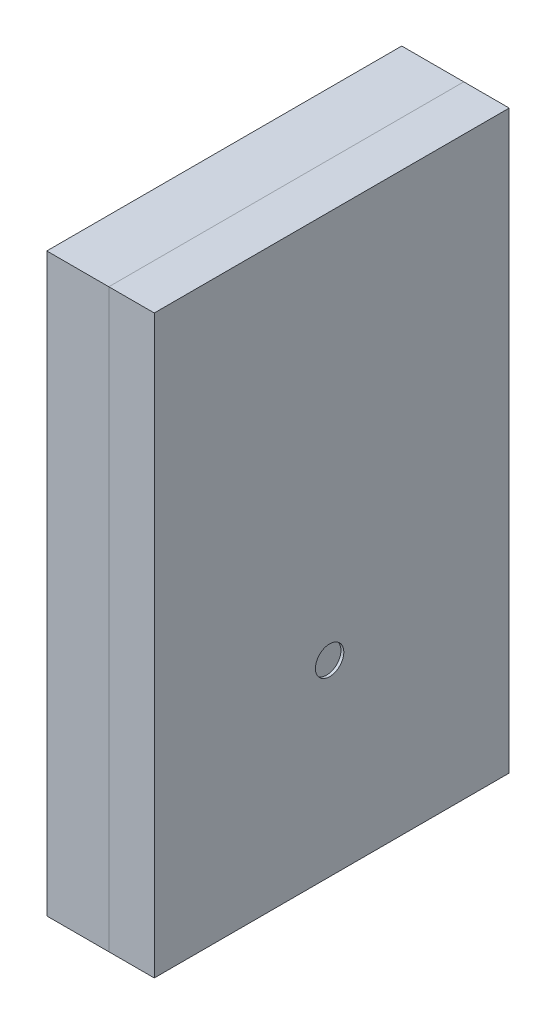
ISO-10303-21;
HEADER;
FILE_DESCRIPTION(('STEP AP214'),'2;1');
FILE_NAME('part.step','',(''),(''),'','','');
FILE_SCHEMA(('AUTOMOTIVE_DESIGN { 1 0 10303 214 1 1 1 1 }'));
ENDSEC;
DATA;
#1=APPLICATION_CONTEXT('core data for automotive mechanical design processes');
#2=APPLICATION_PROTOCOL_DEFINITION('international standard','automotive_design',2000,#1);
#3=PRODUCT_CONTEXT('',#1,'mechanical');
#4=PRODUCT('Part','Part','',(#3));
#5=PRODUCT_RELATED_PRODUCT_CATEGORY('part','',(#4));
#6=PRODUCT_DEFINITION_FORMATION('','',#4);
#7=PRODUCT_DEFINITION_CONTEXT('part definition',#1,'design');
#8=PRODUCT_DEFINITION('design','',#6,#7);
#9=PRODUCT_DEFINITION_SHAPE('','',#8);
#10=(LENGTH_UNIT() NAMED_UNIT(*) SI_UNIT(.MILLI.,.METRE.));
#11=(NAMED_UNIT(*) PLANE_ANGLE_UNIT() SI_UNIT($,.RADIAN.));
#12=(NAMED_UNIT(*) SI_UNIT($,.STERADIAN.) SOLID_ANGLE_UNIT());
#13=UNCERTAINTY_MEASURE_WITH_UNIT(LENGTH_MEASURE(1.E-05),#10,'distance_accuracy_value','');
#14=(GEOMETRIC_REPRESENTATION_CONTEXT(3) GLOBAL_UNCERTAINTY_ASSIGNED_CONTEXT((#13)) GLOBAL_UNIT_ASSIGNED_CONTEXT((#10,
#11,#12)) REPRESENTATION_CONTEXT('',''));
#15=CARTESIAN_POINT('',(0.,0.,0.));
#16=DIRECTION('',(0.,0.,1.));
#17=DIRECTION('',(1.,0.,0.));
#18=AXIS2_PLACEMENT_3D('',#15,#16,#17);
#19=CARTESIAN_POINT('',(21.1473632590377,-509.068007421901,163.632350086192));
#20=DIRECTION('',(-1.,0.,0.));
#21=DIRECTION('',(0.,0.,1.));
#22=AXIS2_PLACEMENT_3D('',#19,#20,#21);
#23=PLANE('',#22);
#24=CARTESIAN_POINT('',(21.1473632590377,-561.547783192139,163.632350086192));
#25=DIRECTION('',(-1.,0.,0.));
#26=DIRECTION('',(0.,0.,1.));
#27=AXIS2_PLACEMENT_3D('',#24,#25,#26);
#28=CIRCLE('',#27,5.);
#29=CARTESIAN_POINT('',(21.1473632590377,-561.547783192139,168.632350086192));
#30=VERTEX_POINT('',#29);
#31=EDGE_CURVE('P0_E165',#30,#30,#28,.T.);
#32=ORIENTED_EDGE('',*,*,#31,.F.);
#33=EDGE_LOOP('',(#32));
#34=FACE_BOUND('',#33,.T.);
#35=CARTESIAN_POINT('',(21.1473632590377,-536.547783192139,163.632350086192));
#36=DIRECTION('',(-1.,0.,0.));
#37=DIRECTION('',(0.,0.,1.));
#38=AXIS2_PLACEMENT_3D('',#35,#36,#37);
#39=CIRCLE('',#38,5.);
#40=CARTESIAN_POINT('',(21.1473632590377,-536.547783192139,168.632350086192));
#41=VERTEX_POINT('',#40);
#42=EDGE_CURVE('P0_E175',#41,#41,#39,.T.);
#43=ORIENTED_EDGE('',*,*,#42,.F.);
#44=EDGE_LOOP('',(#43));
#45=FACE_BOUND('',#44,.T.);
#46=DIRECTION('',(0.,0.,1.));
#47=VECTOR('',#46,1.);
#48=CARTESIAN_POINT('',(21.1473632590377,-575.097133505795,163.632350086192));
#49=LINE('',#48,#47);
#50=CARTESIAN_POINT('',(21.1473632590377,-575.097133505795,100.378378179966));
#51=VERTEX_POINT('',#50);
#52=CARTESIAN_POINT('',(21.1473632590377,-575.097133505795,225.378378179966));
#53=VERTEX_POINT('',#52);
#54=EDGE_CURVE('P0_E94',#51,#53,#49,.T.);
#55=ORIENTED_EDGE('',*,*,#54,.T.);
#56=DIRECTION('',(0.,1.,0.));
#57=VECTOR('',#56,1.);
#58=CARTESIAN_POINT('',(21.1473632590377,-581.870659021303,225.378378179966));
#59=LINE('',#58,#57);
#60=CARTESIAN_POINT('',(21.1473632590377,-372.281758853608,225.378378179966));
#61=VERTEX_POINT('',#60);
#62=EDGE_CURVE('P0_E98',#53,#61,#59,.T.);
#63=ORIENTED_EDGE('',*,*,#62,.T.);
#64=DIRECTION('',(0.,0.,1.));
#65=VECTOR('',#64,1.);
#66=CARTESIAN_POINT('',(21.1473632590377,-372.281758853608,163.632350086192));
#67=LINE('',#66,#65);
#68=CARTESIAN_POINT('',(21.1473632590377,-372.281758853608,100.378378179966));
#69=VERTEX_POINT('',#68);
#70=EDGE_CURVE('P0_E52',#69,#61,#67,.T.);
#71=ORIENTED_EDGE('',*,*,#70,.F.);
#72=DIRECTION('',(0.,1.,0.));
#73=VECTOR('',#72,1.);
#74=CARTESIAN_POINT('',(21.1473632590377,-581.870659021303,100.378378179966));
#75=LINE('',#74,#73);
#76=EDGE_CURVE('P0_E104',#51,#69,#75,.T.);
#77=ORIENTED_EDGE('',*,*,#76,.F.);
#78=EDGE_LOOP('',(#55,#63,#71,#77));
#79=FACE_BOUND('',#78,.T.);
#80=ADVANCED_FACE('P0_F17',(#34,#45,#79),#23,.T.);
#81=CARTESIAN_POINT('',(37.1473632590377,-509.068007421901,163.632350086192));
#82=DIRECTION('',(-1.,0.,0.));
#83=DIRECTION('',(0.,0.,1.));
#84=AXIS2_PLACEMENT_3D('',#81,#82,#83);
#85=CYLINDRICAL_SURFACE('',#84,5.);
#86=CARTESIAN_POINT('',(37.1473632590377,-509.068007421901,163.632350086192));
#87=DIRECTION('',(-1.,0.,0.));
#88=DIRECTION('',(0.,0.,1.));
#89=AXIS2_PLACEMENT_3D('',#86,#87,#88);
#90=CIRCLE('',#89,5.);
#91=CARTESIAN_POINT('',(37.1473632590377,-509.068007421901,168.632350086192));
#92=VERTEX_POINT('',#91);
#93=EDGE_CURVE('P0_E88',#92,#92,#90,.T.);
#94=ORIENTED_EDGE('',*,*,#93,.F.);
#95=EDGE_LOOP('',(#94));
#96=FACE_BOUND('',#95,.T.);
#97=CARTESIAN_POINT('',(36.1473632590377,-509.068007421901,163.632350086192));
#98=DIRECTION('',(-1.,0.,0.));
#99=DIRECTION('',(0.,0.,1.));
#100=AXIS2_PLACEMENT_3D('',#97,#98,#99);
#101=CIRCLE('',#100,5.);
#102=CARTESIAN_POINT('',(36.1473632590377,-509.068007421901,168.632350086192));
#103=VERTEX_POINT('',#102);
#104=EDGE_CURVE('P0_E11',#103,#103,#101,.T.);
#105=ORIENTED_EDGE('',*,*,#104,.T.);
#106=EDGE_LOOP('',(#105));
#107=FACE_BOUND('',#106,.T.);
#108=ADVANCED_FACE('P0_F121',(#96,#107),#85,.F.);
#109=CARTESIAN_POINT('',(37.1473632590377,-575.097133505795,163.632350086192));
#110=DIRECTION('',(0.,-1.,0.));
#111=DIRECTION('',(1.,0.,0.));
#112=AXIS2_PLACEMENT_3D('',#109,#110,#111);
#113=PLANE('',#112);
#114=ORIENTED_EDGE('',*,*,#54,.F.);
#115=DIRECTION('',(-1.,0.,0.));
#116=VECTOR('',#115,1.);
#117=CARTESIAN_POINT('',(37.1473632590378,-575.097133505795,100.378378179966));
#118=LINE('',#117,#116);
#119=CARTESIAN_POINT('',(37.1473632590378,-575.097133505795,100.378378179966));
#120=VERTEX_POINT('',#119);
#121=EDGE_CURVE('P0_E27',#120,#51,#118,.T.);
#122=ORIENTED_EDGE('',*,*,#121,.F.);
#123=DIRECTION('',(0.,0.,1.));
#124=VECTOR('',#123,1.);
#125=CARTESIAN_POINT('',(37.1473632590377,-575.097133505795,163.632350086192));
#126=LINE('',#125,#124);
#127=CARTESIAN_POINT('',(37.1473632590377,-575.097133505795,225.378378179966));
#128=VERTEX_POINT('',#127);
#129=EDGE_CURVE('P0_E84',#120,#128,#126,.T.);
#130=ORIENTED_EDGE('',*,*,#129,.T.);
#131=DIRECTION('',(-1.,0.,0.));
#132=VECTOR('',#131,1.);
#133=CARTESIAN_POINT('',(37.1473632590377,-575.097133505795,225.378378179966));
#134=LINE('',#133,#132);
#135=EDGE_CURVE('P0_E62',#128,#53,#134,.T.);
#136=ORIENTED_EDGE('',*,*,#135,.T.);
#137=EDGE_LOOP('',(#114,#122,#130,#136));
#138=FACE_BOUND('',#137,.T.);
#139=ADVANCED_FACE('P0_F111',(#138),#113,.T.);
#140=CARTESIAN_POINT('',(37.1473632590378,-581.870659021303,100.378378179966));
#141=DIRECTION('',(0.,0.,1.));
#142=DIRECTION('',(1.,0.,0.));
#143=AXIS2_PLACEMENT_3D('',#140,#141,#142);
#144=PLANE('',#143);
#145=ORIENTED_EDGE('',*,*,#76,.T.);
#146=DIRECTION('',(-1.,0.,0.));
#147=VECTOR('',#146,1.);
#148=CARTESIAN_POINT('',(37.1473632590378,-372.281758853608,100.378378179966));
#149=LINE('',#148,#147);
#150=CARTESIAN_POINT('',(37.1473632590378,-372.281758853608,100.378378179966));
#151=VERTEX_POINT('',#150);
#152=EDGE_CURVE('P0_E80',#151,#69,#149,.T.);
#153=ORIENTED_EDGE('',*,*,#152,.F.);
#154=DIRECTION('',(0.,1.,0.));
#155=VECTOR('',#154,1.);
#156=CARTESIAN_POINT('',(37.1473632590378,-581.870659021303,100.378378179966));
#157=LINE('',#156,#155);
#158=EDGE_CURVE('P0_E72',#120,#151,#157,.T.);
#159=ORIENTED_EDGE('',*,*,#158,.F.);
#160=ORIENTED_EDGE('',*,*,#121,.T.);
#161=EDGE_LOOP('',(#145,#153,#159,#160));
#162=FACE_BOUND('',#161,.T.);
#163=ADVANCED_FACE('P0_F112',(#162),#144,.F.);
#164=CARTESIAN_POINT('',(37.1473632590377,-372.281758853608,163.632350086192));
#165=DIRECTION('',(0.,-1.,0.));
#166=DIRECTION('',(1.,0.,0.));
#167=AXIS2_PLACEMENT_3D('',#164,#165,#166);
#168=PLANE('',#167);
#169=ORIENTED_EDGE('',*,*,#70,.T.);
#170=DIRECTION('',(-1.,0.,0.));
#171=VECTOR('',#170,1.);
#172=CARTESIAN_POINT('',(37.1473632590377,-372.281758853608,225.378378179966));
#173=LINE('',#172,#171);
#174=CARTESIAN_POINT('',(37.1473632590377,-372.281758853608,225.378378179966));
#175=VERTEX_POINT('',#174);
#176=EDGE_CURVE('P0_E77',#175,#61,#173,.T.);
#177=ORIENTED_EDGE('',*,*,#176,.F.);
#178=DIRECTION('',(0.,0.,1.));
#179=VECTOR('',#178,1.);
#180=CARTESIAN_POINT('',(37.1473632590377,-372.281758853608,163.632350086192));
#181=LINE('',#180,#179);
#182=EDGE_CURVE('P0_E67',#151,#175,#181,.T.);
#183=ORIENTED_EDGE('',*,*,#182,.F.);
#184=ORIENTED_EDGE('',*,*,#152,.T.);
#185=EDGE_LOOP('',(#169,#177,#183,#184));
#186=FACE_BOUND('',#185,.T.);
#187=ADVANCED_FACE('P0_F78',(#186),#168,.F.);
#188=CARTESIAN_POINT('',(37.1473632590377,-581.870659021303,225.378378179966));
#189=DIRECTION('',(0.,0.,1.));
#190=DIRECTION('',(1.,0.,0.));
#191=AXIS2_PLACEMENT_3D('',#188,#189,#190);
#192=PLANE('',#191);
#193=ORIENTED_EDGE('',*,*,#62,.F.);
#194=ORIENTED_EDGE('',*,*,#135,.F.);
#195=DIRECTION('',(0.,1.,0.));
#196=VECTOR('',#195,1.);
#197=CARTESIAN_POINT('',(37.1473632590377,-581.870659021303,225.378378179966));
#198=LINE('',#197,#196);
#199=EDGE_CURVE('P0_E71',#128,#175,#198,.T.);
#200=ORIENTED_EDGE('',*,*,#199,.T.);
#201=ORIENTED_EDGE('',*,*,#176,.T.);
#202=EDGE_LOOP('',(#193,#194,#200,#201));
#203=FACE_BOUND('',#202,.T.);
#204=ADVANCED_FACE('P0_F82',(#203),#192,.T.);
#205=CARTESIAN_POINT('',(37.1473632590377,-581.870659021303,163.632350086192));
#206=DIRECTION('',(-1.,0.,0.));
#207=DIRECTION('',(0.,0.,1.));
#208=AXIS2_PLACEMENT_3D('',#205,#206,#207);
#209=PLANE('',#208);
#210=ORIENTED_EDGE('',*,*,#93,.T.);
#211=EDGE_LOOP('',(#210));
#212=FACE_BOUND('',#211,.T.);
#213=ORIENTED_EDGE('',*,*,#129,.F.);
#214=ORIENTED_EDGE('',*,*,#158,.T.);
#215=ORIENTED_EDGE('',*,*,#182,.T.);
#216=ORIENTED_EDGE('',*,*,#199,.F.);
#217=EDGE_LOOP('',(#213,#214,#215,#216));
#218=FACE_BOUND('',#217,.T.);
#219=ADVANCED_FACE('P0_F70',(#212,#218),#209,.F.);
#220=CARTESIAN_POINT('',(36.1473632590377,-509.068007421901,163.632350086192));
#221=DIRECTION('',(-1.,0.,0.));
#222=DIRECTION('',(0.,0.,1.));
#223=AXIS2_PLACEMENT_3D('',#220,#221,#222);
#224=PLANE('',#223);
#225=ORIENTED_EDGE('',*,*,#104,.F.);
#226=EDGE_LOOP('',(#225));
#227=FACE_BOUND('',#226,.T.);
#228=ADVANCED_FACE('P0_F19',(#227),#224,.F.);
#229=CARTESIAN_POINT('',(26.1473632590377,-536.547783192139,163.632350086192));
#230=DIRECTION('',(-1.,0.,0.));
#231=DIRECTION('',(0.,0.,1.));
#232=AXIS2_PLACEMENT_3D('',#229,#230,#231);
#233=CYLINDRICAL_SURFACE('',#232,5.);
#234=CARTESIAN_POINT('',(26.1473632590377,-536.547783192139,163.632350086192));
#235=DIRECTION('',(-1.,0.,0.));
#236=DIRECTION('',(0.,0.,1.));
#237=AXIS2_PLACEMENT_3D('',#234,#235,#236);
#238=CIRCLE('',#237,5.);
#239=CARTESIAN_POINT('',(26.1473632590377,-536.547783192139,168.632350086192));
#240=VERTEX_POINT('',#239);
#241=EDGE_CURVE('P0_E169',#240,#240,#238,.T.);
#242=ORIENTED_EDGE('',*,*,#241,.F.);
#243=EDGE_LOOP('',(#242));
#244=FACE_BOUND('',#243,.T.);
#245=ORIENTED_EDGE('',*,*,#42,.T.);
#246=EDGE_LOOP('',(#245));
#247=FACE_BOUND('',#246,.T.);
#248=ADVANCED_FACE('P0_F142',(#244,#247),#233,.F.);
#249=CARTESIAN_POINT('',(26.1473632590377,-536.547783192139,163.632350086192));
#250=DIRECTION('',(-1.,0.,0.));
#251=DIRECTION('',(0.,0.,1.));
#252=AXIS2_PLACEMENT_3D('',#249,#250,#251);
#253=PLANE('',#252);
#254=ORIENTED_EDGE('',*,*,#241,.T.);
#255=EDGE_LOOP('',(#254));
#256=FACE_BOUND('',#255,.T.);
#257=ADVANCED_FACE('P0_F148',(#256),#253,.T.);
#258=CARTESIAN_POINT('',(26.1473632590377,-561.547783192139,163.632350086192));
#259=DIRECTION('',(-1.,0.,0.));
#260=DIRECTION('',(0.,0.,1.));
#261=AXIS2_PLACEMENT_3D('',#258,#259,#260);
#262=CYLINDRICAL_SURFACE('',#261,5.);
#263=CARTESIAN_POINT('',(26.1473632590377,-561.547783192139,163.632350086192));
#264=DIRECTION('',(-1.,0.,0.));
#265=DIRECTION('',(0.,0.,1.));
#266=AXIS2_PLACEMENT_3D('',#263,#264,#265);
#267=CIRCLE('',#266,5.);
#268=CARTESIAN_POINT('',(26.1473632590377,-561.547783192139,168.632350086192));
#269=VERTEX_POINT('',#268);
#270=EDGE_CURVE('P0_E99',#269,#269,#267,.T.);
#271=ORIENTED_EDGE('',*,*,#270,.F.);
#272=EDGE_LOOP('',(#271));
#273=FACE_BOUND('',#272,.T.);
#274=ORIENTED_EDGE('',*,*,#31,.T.);
#275=EDGE_LOOP('',(#274));
#276=FACE_BOUND('',#275,.T.);
#277=ADVANCED_FACE('P0_F152',(#273,#276),#262,.F.);
#278=CARTESIAN_POINT('',(26.1473632590377,-561.547783192139,163.632350086192));
#279=DIRECTION('',(-1.,0.,0.));
#280=DIRECTION('',(0.,0.,1.));
#281=AXIS2_PLACEMENT_3D('',#278,#279,#280);
#282=PLANE('',#281);
#283=ORIENTED_EDGE('',*,*,#270,.T.);
#284=EDGE_LOOP('',(#283));
#285=FACE_BOUND('',#284,.T.);
#286=ADVANCED_FACE('P0_F156',(#285),#282,.T.);
#287=CLOSED_SHELL('',(#80,#108,#139,#163,#187,#204,#219,#228,#248,#257,#277,#286));
#288=MANIFOLD_SOLID_BREP('P0_B1',#287);
#289=CARTESIAN_POINT('',(4.29736325903775,-575.101758853608,100.378378179966));
#290=DIRECTION('',(0.,0.,1.));
#291=DIRECTION('',(1.,0.,0.));
#292=AXIS2_PLACEMENT_3D('',#289,#290,#291);
#293=PLANE('',#292);
#294=DIRECTION('',(0.,1.,0.));
#295=VECTOR('',#294,1.);
#296=CARTESIAN_POINT('',(-0.702636740962248,-575.101758853608,100.378378179966));
#297=LINE('',#296,#295);
#298=CARTESIAN_POINT('',(-0.702636740962248,-575.101758853608,100.378378179966));
#299=VERTEX_POINT('',#298);
#300=CARTESIAN_POINT('',(-0.702636740962248,-372.281758853608,100.378378179966));
#301=VERTEX_POINT('',#300);
#302=EDGE_CURVE('P1_E136',#299,#301,#297,.T.);
#303=ORIENTED_EDGE('',*,*,#302,.T.);
#304=DIRECTION('',(-1.,0.,0.));
#305=VECTOR('',#304,1.);
#306=CARTESIAN_POINT('',(4.29736325903775,-372.281758853608,100.378378179966));
#307=LINE('',#306,#305);
#308=CARTESIAN_POINT('',(21.1473632590378,-372.281758853608,100.378378179966));
#309=VERTEX_POINT('',#308);
#310=EDGE_CURVE('P1_E11',#309,#301,#307,.T.);
#311=ORIENTED_EDGE('',*,*,#310,.F.);
#312=DIRECTION('',(0.,-1.,0.));
#313=VECTOR('',#312,1.);
#314=CARTESIAN_POINT('',(21.1473632590378,-372.281758853608,100.378378179966));
#315=LINE('',#314,#313);
#316=CARTESIAN_POINT('',(21.1473632590378,-575.101758853608,100.378378179966));
#317=VERTEX_POINT('',#316);
#318=EDGE_CURVE('P1_E114',#309,#317,#315,.T.);
#319=ORIENTED_EDGE('',*,*,#318,.T.);
#320=DIRECTION('',(-1.,0.,0.));
#321=VECTOR('',#320,1.);
#322=CARTESIAN_POINT('',(4.29736325903775,-575.101758853608,100.378378179966));
#323=LINE('',#322,#321);
#324=EDGE_CURVE('P1_E145',#317,#299,#323,.T.);
#325=ORIENTED_EDGE('',*,*,#324,.T.);
#326=EDGE_LOOP('',(#303,#311,#319,#325));
#327=FACE_BOUND('',#326,.T.);
#328=ADVANCED_FACE('P1_F17',(#327),#293,.F.);
#329=CARTESIAN_POINT('',(4.29736325903775,-372.281758853608,225.378378179966));
#330=DIRECTION('',(0.,-1.,0.));
#331=DIRECTION('',(-1.,0.,0.));
#332=AXIS2_PLACEMENT_3D('',#329,#330,#331);
#333=PLANE('',#332);
#334=DIRECTION('',(0.,0.,1.));
#335=VECTOR('',#334,1.);
#336=CARTESIAN_POINT('',(-0.702636740962251,-372.281758853608,225.378378179966));
#337=LINE('',#336,#335);
#338=CARTESIAN_POINT('',(-0.702636740962251,-372.281758853608,225.378378179966));
#339=VERTEX_POINT('',#338);
#340=EDGE_CURVE('P1_E139',#301,#339,#337,.T.);
#341=ORIENTED_EDGE('',*,*,#340,.T.);
#342=DIRECTION('',(-1.,0.,0.));
#343=VECTOR('',#342,1.);
#344=CARTESIAN_POINT('',(4.29736325903775,-372.281758853608,225.378378179966));
#345=LINE('',#344,#343);
#346=CARTESIAN_POINT('',(21.1473632590378,-372.281758853608,225.378378179966));
#347=VERTEX_POINT('',#346);
#348=EDGE_CURVE('P1_E24',#347,#339,#345,.T.);
#349=ORIENTED_EDGE('',*,*,#348,.F.);
#350=DIRECTION('',(0.,0.,-1.));
#351=VECTOR('',#350,1.);
#352=CARTESIAN_POINT('',(21.1473632590378,-372.281758853608,100.378378179966));
#353=LINE('',#352,#351);
#354=EDGE_CURVE('P1_E127',#347,#309,#353,.T.);
#355=ORIENTED_EDGE('',*,*,#354,.T.);
#356=ORIENTED_EDGE('',*,*,#310,.T.);
#357=EDGE_LOOP('',(#341,#349,#355,#356));
#358=FACE_BOUND('',#357,.T.);
#359=ADVANCED_FACE('P1_F166',(#358),#333,.F.);
#360=CARTESIAN_POINT('',(4.29736325903775,-575.101758853608,225.378378179966));
#361=DIRECTION('',(0.,0.,-1.));
#362=DIRECTION('',(-1.,0.,0.));
#363=AXIS2_PLACEMENT_3D('',#360,#361,#362);
#364=PLANE('',#363);
#365=DIRECTION('',(0.,-1.,0.));
#366=VECTOR('',#365,1.);
#367=CARTESIAN_POINT('',(-0.702636740962251,-575.101758853608,225.378378179966));
#368=LINE('',#367,#366);
#369=CARTESIAN_POINT('',(-0.702636740962251,-575.101758853608,225.378378179966));
#370=VERTEX_POINT('',#369);
#371=EDGE_CURVE('P1_E141',#339,#370,#368,.T.);
#372=ORIENTED_EDGE('',*,*,#371,.T.);
#373=DIRECTION('',(-1.,0.,0.));
#374=VECTOR('',#373,1.);
#375=CARTESIAN_POINT('',(4.29736325903775,-575.101758853608,225.378378179966));
#376=LINE('',#375,#374);
#377=CARTESIAN_POINT('',(21.1473632590378,-575.101758853608,225.378378179966));
#378=VERTEX_POINT('',#377);
#379=EDGE_CURVE('P1_E148',#378,#370,#376,.T.);
#380=ORIENTED_EDGE('',*,*,#379,.F.);
#381=DIRECTION('',(0.,1.,0.));
#382=VECTOR('',#381,1.);
#383=CARTESIAN_POINT('',(21.1473632590378,-372.281758853608,225.378378179966));
#384=LINE('',#383,#382);
#385=EDGE_CURVE('P1_E124',#378,#347,#384,.T.);
#386=ORIENTED_EDGE('',*,*,#385,.T.);
#387=ORIENTED_EDGE('',*,*,#348,.T.);
#388=EDGE_LOOP('',(#372,#380,#386,#387));
#389=FACE_BOUND('',#388,.T.);
#390=ADVANCED_FACE('P1_F153',(#389),#364,.F.);
#391=CARTESIAN_POINT('',(4.29736325903775,-575.101758853608,225.378378179966));
#392=DIRECTION('',(0.,1.,0.));
#393=DIRECTION('',(1.,0.,0.));
#394=AXIS2_PLACEMENT_3D('',#391,#392,#393);
#395=PLANE('',#394);
#396=DIRECTION('',(0.,0.,-1.));
#397=VECTOR('',#396,1.);
#398=CARTESIAN_POINT('',(-0.702636740962251,-575.101758853608,225.378378179966));
#399=LINE('',#398,#397);
#400=EDGE_CURVE('P1_E143',#370,#299,#399,.T.);
#401=ORIENTED_EDGE('',*,*,#400,.T.);
#402=ORIENTED_EDGE('',*,*,#324,.F.);
#403=DIRECTION('',(0.,0.,1.));
#404=VECTOR('',#403,1.);
#405=CARTESIAN_POINT('',(21.1473632590378,-575.101758853608,100.378378179966));
#406=LINE('',#405,#404);
#407=EDGE_CURVE('P1_E121',#317,#378,#406,.T.);
#408=ORIENTED_EDGE('',*,*,#407,.T.);
#409=ORIENTED_EDGE('',*,*,#379,.T.);
#410=EDGE_LOOP('',(#401,#402,#408,#409));
#411=FACE_BOUND('',#410,.T.);
#412=ADVANCED_FACE('P1_F162',(#411),#395,.F.);
#413=CARTESIAN_POINT('',(-0.702636740962249,-473.691758853608,162.878378179966));
#414=DIRECTION('',(-1.,0.,0.));
#415=DIRECTION('',(0.,0.,1.));
#416=AXIS2_PLACEMENT_3D('',#413,#414,#415);
#417=PLANE('',#416);
#418=CARTESIAN_POINT('',(-0.70263674096225,-455.366407842684,193.834517624346));
#419=DIRECTION('',(-1.,0.,0.));
#420=DIRECTION('',(0.,0.,1.));
#421=AXIS2_PLACEMENT_3D('',#418,#419,#420);
#422=CIRCLE('',#421,21.5);
#423=CARTESIAN_POINT('',(-0.702636740962251,-455.366407842684,215.334517624346));
#424=VERTEX_POINT('',#423);
#425=EDGE_CURVE('P1_E103',#424,#424,#422,.T.);
#426=ORIENTED_EDGE('',*,*,#425,.F.);
#427=EDGE_LOOP('',(#426));
#428=FACE_BOUND('',#427,.T.);
#429=CARTESIAN_POINT('',(-0.702636740962249,-405.426407842684,133.834517624346));
#430=DIRECTION('',(-1.,0.,0.));
#431=DIRECTION('',(0.,0.,1.));
#432=AXIS2_PLACEMENT_3D('',#429,#430,#431);
#433=CIRCLE('',#432,21.5);
#434=CARTESIAN_POINT('',(-0.702636740962249,-405.426407842684,155.334517624346));
#435=VERTEX_POINT('',#434);
#436=EDGE_CURVE('P1_E106',#435,#435,#433,.T.);
#437=ORIENTED_EDGE('',*,*,#436,.F.);
#438=EDGE_LOOP('',(#437));
#439=FACE_BOUND('',#438,.T.);
#440=CARTESIAN_POINT('',(-0.70263674096225,-405.426407842684,193.834517624346));
#441=DIRECTION('',(-1.,0.,0.));
#442=DIRECTION('',(0.,0.,1.));
#443=AXIS2_PLACEMENT_3D('',#440,#441,#442);
#444=CIRCLE('',#443,21.5);
#445=CARTESIAN_POINT('',(-0.702636740962251,-405.426407842684,215.334517624346));
#446=VERTEX_POINT('',#445);
#447=EDGE_CURVE('P1_E275',#446,#446,#444,.T.);
#448=ORIENTED_EDGE('',*,*,#447,.F.);
#449=EDGE_LOOP('',(#448));
#450=FACE_BOUND('',#449,.T.);
#451=CARTESIAN_POINT('',(-0.70263674096225,-548.986407842684,193.834517624346));
#452=DIRECTION('',(-1.,0.,0.));
#453=DIRECTION('',(0.,0.,1.));
#454=AXIS2_PLACEMENT_3D('',#451,#452,#453);
#455=CIRCLE('',#454,21.5);
#456=CARTESIAN_POINT('',(-0.702636740962251,-548.986407842684,215.334517624346));
#457=VERTEX_POINT('',#456);
#458=EDGE_CURVE('P1_E272',#457,#457,#455,.T.);
#459=ORIENTED_EDGE('',*,*,#458,.F.);
#460=EDGE_LOOP('',(#459));
#461=FACE_BOUND('',#460,.T.);
#462=CARTESIAN_POINT('',(-0.702636740962249,-502.176407842684,133.834517624346));
#463=DIRECTION('',(-1.,0.,0.));
#464=DIRECTION('',(0.,0.,1.));
#465=AXIS2_PLACEMENT_3D('',#462,#463,#464);
#466=CIRCLE('',#465,21.5);
#467=CARTESIAN_POINT('',(-0.702636740962249,-502.176407842684,155.334517624346));
#468=VERTEX_POINT('',#467);
#469=EDGE_CURVE('P1_E234',#468,#468,#466,.T.);
#470=ORIENTED_EDGE('',*,*,#469,.F.);
#471=EDGE_LOOP('',(#470));
#472=FACE_BOUND('',#471,.T.);
#473=CARTESIAN_POINT('',(-0.702636740962249,-455.366407842684,133.834517624346));
#474=DIRECTION('',(-1.,0.,0.));
#475=DIRECTION('',(0.,0.,1.));
#476=AXIS2_PLACEMENT_3D('',#473,#474,#475);
#477=CIRCLE('',#476,21.5);
#478=CARTESIAN_POINT('',(-0.702636740962249,-455.366407842684,155.334517624346));
#479=VERTEX_POINT('',#478);
#480=EDGE_CURVE('P1_E268',#479,#479,#477,.T.);
#481=ORIENTED_EDGE('',*,*,#480,.F.);
#482=EDGE_LOOP('',(#481));
#483=FACE_BOUND('',#482,.T.);
#484=CARTESIAN_POINT('',(-0.70263674096225,-502.176407842684,193.834517624346));
#485=DIRECTION('',(-1.,0.,0.));
#486=DIRECTION('',(0.,0.,1.));
#487=AXIS2_PLACEMENT_3D('',#484,#485,#486);
#488=CIRCLE('',#487,21.5);
#489=CARTESIAN_POINT('',(-0.702636740962251,-502.176407842684,215.334517624346));
#490=VERTEX_POINT('',#489);
#491=EDGE_CURVE('P1_E265',#490,#490,#488,.T.);
#492=ORIENTED_EDGE('',*,*,#491,.F.);
#493=EDGE_LOOP('',(#492));
#494=FACE_BOUND('',#493,.T.);
#495=CARTESIAN_POINT('',(-0.702636740962249,-548.986407842684,133.834517624346));
#496=DIRECTION('',(-1.,0.,0.));
#497=DIRECTION('',(0.,0.,1.));
#498=AXIS2_PLACEMENT_3D('',#495,#496,#497);
#499=CIRCLE('',#498,21.5);
#500=CARTESIAN_POINT('',(-0.702636740962249,-548.986407842684,155.334517624346));
#501=VERTEX_POINT('',#500);
#502=EDGE_CURVE('P1_E262',#501,#501,#499,.T.);
#503=ORIENTED_EDGE('',*,*,#502,.F.);
#504=EDGE_LOOP('',(#503));
#505=FACE_BOUND('',#504,.T.);
#506=ORIENTED_EDGE('',*,*,#302,.F.);
#507=ORIENTED_EDGE('',*,*,#400,.F.);
#508=ORIENTED_EDGE('',*,*,#371,.F.);
#509=ORIENTED_EDGE('',*,*,#340,.F.);
#510=EDGE_LOOP('',(#506,#507,#508,#509));
#511=FACE_BOUND('',#510,.T.);
#512=ADVANCED_FACE('P1_F160',(#428,#439,#450,#461,#472,#483,#494,#505,#511),#417,.T.);
#513=CARTESIAN_POINT('',(21.1473632590378,-571.770279423351,222.243714381443));
#514=DIRECTION('',(0.,0.,1.));
#515=DIRECTION('',(1.,0.,0.));
#516=AXIS2_PLACEMENT_3D('',#513,#514,#515);
#517=PLANE('',#516);
#518=DIRECTION('',(-1.,0.,0.));
#519=VECTOR('',#518,1.);
#520=CARTESIAN_POINT('',(21.1473632590378,-571.770279423351,222.243714381443));
#521=LINE('',#520,#519);
#522=CARTESIAN_POINT('',(21.1473632590378,-571.770279423351,222.243714381443));
#523=VERTEX_POINT('',#522);
#524=CARTESIAN_POINT('',(4.29736325903775,-571.770279423351,222.243714381443));
#525=VERTEX_POINT('',#524);
#526=EDGE_CURVE('P1_E112',#523,#525,#521,.T.);
#527=ORIENTED_EDGE('',*,*,#526,.T.);
#528=DIRECTION('',(0.,1.,0.));
#529=VECTOR('',#528,1.);
#530=CARTESIAN_POINT('',(4.29736325903775,-473.691758853608,222.243714381443));
#531=LINE('',#530,#529);
#532=CARTESIAN_POINT('',(4.29736325903775,-375.613238283866,222.243714381443));
#533=VERTEX_POINT('',#532);
#534=EDGE_CURVE('P1_E31',#525,#533,#531,.T.);
#535=ORIENTED_EDGE('',*,*,#534,.T.);
#536=DIRECTION('',(-1.,0.,0.));
#537=VECTOR('',#536,1.);
#538=CARTESIAN_POINT('',(21.1473632590378,-375.613238283866,222.243714381443));
#539=LINE('',#538,#537);
#540=CARTESIAN_POINT('',(21.1473632590378,-375.613238283866,222.243714381443));
#541=VERTEX_POINT('',#540);
#542=EDGE_CURVE('P1_E79',#541,#533,#539,.T.);
#543=ORIENTED_EDGE('',*,*,#542,.F.);
#544=DIRECTION('',(0.,1.,0.));
#545=VECTOR('',#544,1.);
#546=CARTESIAN_POINT('',(21.1473632590378,-571.770279423351,222.243714381443));
#547=LINE('',#546,#545);
#548=EDGE_CURVE('P1_E84',#523,#541,#547,.T.);
#549=ORIENTED_EDGE('',*,*,#548,.F.);
#550=EDGE_LOOP('',(#527,#535,#543,#549));
#551=FACE_BOUND('',#550,.T.);
#552=ADVANCED_FACE('P1_F82',(#551),#517,.F.);
#553=CARTESIAN_POINT('',(21.1473632590378,-571.770279423351,103.513041978488));
#554=DIRECTION('',(0.,-1.,0.));
#555=DIRECTION('',(-1.,0.,0.));
#556=AXIS2_PLACEMENT_3D('',#553,#554,#555);
#557=PLANE('',#556);
#558=DIRECTION('',(-1.,0.,0.));
#559=VECTOR('',#558,1.);
#560=CARTESIAN_POINT('',(21.1473632590378,-571.770279423351,103.513041978488));
#561=LINE('',#560,#559);
#562=CARTESIAN_POINT('',(21.1473632590378,-571.770279423351,103.513041978488));
#563=VERTEX_POINT('',#562);
#564=CARTESIAN_POINT('',(4.29736325903775,-571.770279423351,103.513041978488));
#565=VERTEX_POINT('',#564);
#566=EDGE_CURVE('P1_E115',#563,#565,#561,.T.);
#567=ORIENTED_EDGE('',*,*,#566,.T.);
#568=DIRECTION('',(0.,0.,1.));
#569=VECTOR('',#568,1.);
#570=CARTESIAN_POINT('',(4.29736325903775,-571.770279423351,162.878378179966));
#571=LINE('',#570,#569);
#572=EDGE_CURVE('P1_E35',#565,#525,#571,.T.);
#573=ORIENTED_EDGE('',*,*,#572,.T.);
#574=ORIENTED_EDGE('',*,*,#526,.F.);
#575=DIRECTION('',(0.,0.,1.));
#576=VECTOR('',#575,1.);
#577=CARTESIAN_POINT('',(21.1473632590378,-571.770279423351,103.513041978488));
#578=LINE('',#577,#576);
#579=EDGE_CURVE('P1_E89',#563,#523,#578,.T.);
#580=ORIENTED_EDGE('',*,*,#579,.F.);
#581=EDGE_LOOP('',(#567,#573,#574,#580));
#582=FACE_BOUND('',#581,.T.);
#583=ADVANCED_FACE('P1_F189',(#582),#557,.F.);
#584=CARTESIAN_POINT('',(21.1473632590378,-571.770279423351,103.513041978488));
#585=DIRECTION('',(0.,0.,-1.));
#586=DIRECTION('',(-1.,0.,0.));
#587=AXIS2_PLACEMENT_3D('',#584,#585,#586);
#588=PLANE('',#587);
#589=DIRECTION('',(-1.,0.,0.));
#590=VECTOR('',#589,1.);
#591=CARTESIAN_POINT('',(21.1473632590378,-375.613238283866,103.513041978488));
#592=LINE('',#591,#590);
#593=CARTESIAN_POINT('',(21.1473632590378,-375.613238283866,103.513041978488));
#594=VERTEX_POINT('',#593);
#595=CARTESIAN_POINT('',(4.29736325903775,-375.613238283866,103.513041978488));
#596=VERTEX_POINT('',#595);
#597=EDGE_CURVE('P1_E88',#594,#596,#592,.T.);
#598=ORIENTED_EDGE('',*,*,#597,.T.);
#599=DIRECTION('',(0.,-1.,0.));
#600=VECTOR('',#599,1.);
#601=CARTESIAN_POINT('',(4.29736325903775,-473.691758853608,103.513041978488));
#602=LINE('',#601,#600);
#603=EDGE_CURVE('P1_E132',#596,#565,#602,.T.);
#604=ORIENTED_EDGE('',*,*,#603,.T.);
#605=ORIENTED_EDGE('',*,*,#566,.F.);
#606=DIRECTION('',(0.,-1.,0.));
#607=VECTOR('',#606,1.);
#608=CARTESIAN_POINT('',(21.1473632590378,-571.770279423351,103.513041978488));
#609=LINE('',#608,#607);
#610=EDGE_CURVE('P1_E98',#594,#563,#609,.T.);
#611=ORIENTED_EDGE('',*,*,#610,.F.);
#612=EDGE_LOOP('',(#598,#604,#605,#611));
#613=FACE_BOUND('',#612,.T.);
#614=ADVANCED_FACE('P1_F192',(#613),#588,.F.);
#615=CARTESIAN_POINT('',(21.1473632590378,-375.613238283866,103.513041978488));
#616=DIRECTION('',(0.,1.,0.));
#617=DIRECTION('',(1.,0.,0.));
#618=AXIS2_PLACEMENT_3D('',#615,#616,#617);
#619=PLANE('',#618);
#620=ORIENTED_EDGE('',*,*,#542,.T.);
#621=DIRECTION('',(0.,0.,-1.));
#622=VECTOR('',#621,1.);
#623=CARTESIAN_POINT('',(4.29736325903775,-375.613238283866,162.878378179966));
#624=LINE('',#623,#622);
#625=EDGE_CURVE('P1_E130',#533,#596,#624,.T.);
#626=ORIENTED_EDGE('',*,*,#625,.T.);
#627=ORIENTED_EDGE('',*,*,#597,.F.);
#628=DIRECTION('',(0.,0.,-1.));
#629=VECTOR('',#628,1.);
#630=CARTESIAN_POINT('',(21.1473632590378,-375.613238283866,103.513041978488));
#631=LINE('',#630,#629);
#632=EDGE_CURVE('P1_E93',#541,#594,#631,.T.);
#633=ORIENTED_EDGE('',*,*,#632,.F.);
#634=EDGE_LOOP('',(#620,#626,#627,#633));
#635=FACE_BOUND('',#634,.T.);
#636=ADVANCED_FACE('P1_F94',(#635),#619,.F.);
#637=CARTESIAN_POINT('',(21.1473632590378,-473.691758853608,162.878378179966));
#638=DIRECTION('',(-1.,0.,0.));
#639=DIRECTION('',(0.,0.,1.));
#640=AXIS2_PLACEMENT_3D('',#637,#638,#639);
#641=PLANE('',#640);
#642=ORIENTED_EDGE('',*,*,#579,.T.);
#643=ORIENTED_EDGE('',*,*,#548,.T.);
#644=ORIENTED_EDGE('',*,*,#632,.T.);
#645=ORIENTED_EDGE('',*,*,#610,.T.);
#646=EDGE_LOOP('',(#642,#643,#644,#645));
#647=FACE_BOUND('',#646,.T.);
#648=ORIENTED_EDGE('',*,*,#318,.F.);
#649=ORIENTED_EDGE('',*,*,#354,.F.);
#650=ORIENTED_EDGE('',*,*,#385,.F.);
#651=ORIENTED_EDGE('',*,*,#407,.F.);
#652=EDGE_LOOP('',(#648,#649,#650,#651));
#653=FACE_BOUND('',#652,.T.);
#654=ADVANCED_FACE('P1_F100',(#647,#653),#641,.F.);
#655=CARTESIAN_POINT('',(4.29736325903775,-473.691758853608,162.878378179966));
#656=DIRECTION('',(-1.,0.,0.));
#657=DIRECTION('',(0.,0.,1.));
#658=AXIS2_PLACEMENT_3D('',#655,#656,#657);
#659=PLANE('',#658);
#660=CARTESIAN_POINT('',(4.29736325903775,-455.366407842684,193.834517624346));
#661=DIRECTION('',(1.,0.,0.));
#662=DIRECTION('',(0.,0.,-1.));
#663=AXIS2_PLACEMENT_3D('',#660,#661,#662);
#664=CIRCLE('',#663,21.5);
#665=CARTESIAN_POINT('',(4.29736325903775,-455.366407842684,172.334517624346));
#666=VERTEX_POINT('',#665);
#667=EDGE_CURVE('P1_E246',#666,#666,#664,.T.);
#668=ORIENTED_EDGE('',*,*,#667,.F.);
#669=EDGE_LOOP('',(#668));
#670=FACE_BOUND('',#669,.T.);
#671=CARTESIAN_POINT('',(4.29736325903775,-405.426407842684,133.834517624346));
#672=DIRECTION('',(1.,0.,0.));
#673=DIRECTION('',(0.,0.,-1.));
#674=AXIS2_PLACEMENT_3D('',#671,#672,#673);
#675=CIRCLE('',#674,21.5);
#676=CARTESIAN_POINT('',(4.29736325903775,-405.426407842684,112.334517624346));
#677=VERTEX_POINT('',#676);
#678=EDGE_CURVE('P1_E248',#677,#677,#675,.T.);
#679=ORIENTED_EDGE('',*,*,#678,.F.);
#680=EDGE_LOOP('',(#679));
#681=FACE_BOUND('',#680,.T.);
#682=CARTESIAN_POINT('',(4.29736325903775,-405.426407842684,193.834517624346));
#683=DIRECTION('',(1.,0.,0.));
#684=DIRECTION('',(0.,0.,-1.));
#685=AXIS2_PLACEMENT_3D('',#682,#683,#684);
#686=CIRCLE('',#685,21.5);
#687=CARTESIAN_POINT('',(4.29736325903775,-405.426407842684,172.334517624346));
#688=VERTEX_POINT('',#687);
#689=EDGE_CURVE('P1_E251',#688,#688,#686,.T.);
#690=ORIENTED_EDGE('',*,*,#689,.F.);
#691=EDGE_LOOP('',(#690));
#692=FACE_BOUND('',#691,.T.);
#693=CARTESIAN_POINT('',(4.29736325903775,-548.986407842684,193.834517624346));
#694=DIRECTION('',(1.,0.,0.));
#695=DIRECTION('',(0.,0.,-1.));
#696=AXIS2_PLACEMENT_3D('',#693,#694,#695);
#697=CIRCLE('',#696,21.5);
#698=CARTESIAN_POINT('',(4.29736325903775,-548.986407842684,172.334517624346));
#699=VERTEX_POINT('',#698);
#700=EDGE_CURVE('P1_E254',#699,#699,#697,.T.);
#701=ORIENTED_EDGE('',*,*,#700,.F.);
#702=EDGE_LOOP('',(#701));
#703=FACE_BOUND('',#702,.T.);
#704=CARTESIAN_POINT('',(4.29736325903775,-502.176407842684,133.834517624346));
#705=DIRECTION('',(1.,0.,0.));
#706=DIRECTION('',(0.,0.,-1.));
#707=AXIS2_PLACEMENT_3D('',#704,#705,#706);
#708=CIRCLE('',#707,21.5);
#709=CARTESIAN_POINT('',(4.29736325903775,-502.176407842684,112.334517624346));
#710=VERTEX_POINT('',#709);
#711=EDGE_CURVE('P1_E237',#710,#710,#708,.T.);
#712=ORIENTED_EDGE('',*,*,#711,.F.);
#713=EDGE_LOOP('',(#712));
#714=FACE_BOUND('',#713,.T.);
#715=CARTESIAN_POINT('',(4.29736325903775,-455.366407842684,133.834517624346));
#716=DIRECTION('',(1.,0.,0.));
#717=DIRECTION('',(0.,0.,-1.));
#718=AXIS2_PLACEMENT_3D('',#715,#716,#717);
#719=CIRCLE('',#718,21.5);
#720=CARTESIAN_POINT('',(4.29736325903775,-455.366407842684,112.334517624346));
#721=VERTEX_POINT('',#720);
#722=EDGE_CURVE('P1_E239',#721,#721,#719,.T.);
#723=ORIENTED_EDGE('',*,*,#722,.F.);
#724=EDGE_LOOP('',(#723));
#725=FACE_BOUND('',#724,.T.);
#726=CARTESIAN_POINT('',(4.29736325903775,-502.176407842684,193.834517624346));
#727=DIRECTION('',(1.,0.,0.));
#728=DIRECTION('',(0.,0.,-1.));
#729=AXIS2_PLACEMENT_3D('',#726,#727,#728);
#730=CIRCLE('',#729,21.5);
#731=CARTESIAN_POINT('',(4.29736325903775,-502.176407842684,172.334517624346));
#732=VERTEX_POINT('',#731);
#733=EDGE_CURVE('P1_E242',#732,#732,#730,.T.);
#734=ORIENTED_EDGE('',*,*,#733,.F.);
#735=EDGE_LOOP('',(#734));
#736=FACE_BOUND('',#735,.T.);
#737=CARTESIAN_POINT('',(4.29736325903775,-548.986407842684,133.834517624346));
#738=DIRECTION('',(1.,0.,0.));
#739=DIRECTION('',(0.,0.,-1.));
#740=AXIS2_PLACEMENT_3D('',#737,#738,#739);
#741=CIRCLE('',#740,21.5);
#742=CARTESIAN_POINT('',(4.29736325903775,-548.986407842684,112.334517624346));
#743=VERTEX_POINT('',#742);
#744=EDGE_CURVE('P1_E257',#743,#743,#741,.T.);
#745=ORIENTED_EDGE('',*,*,#744,.F.);
#746=EDGE_LOOP('',(#745));
#747=FACE_BOUND('',#746,.T.);
#748=ORIENTED_EDGE('',*,*,#534,.F.);
#749=ORIENTED_EDGE('',*,*,#572,.F.);
#750=ORIENTED_EDGE('',*,*,#603,.F.);
#751=ORIENTED_EDGE('',*,*,#625,.F.);
#752=EDGE_LOOP('',(#748,#749,#750,#751));
#753=FACE_BOUND('',#752,.T.);
#754=ADVANCED_FACE('P1_F180',(#670,#681,#692,#703,#714,#725,#736,#747,#753),#659,.F.);
#755=CARTESIAN_POINT('',(-17.5526367409622,-548.986407842684,133.834517624346));
#756=DIRECTION('',(1.,0.,0.));
#757=DIRECTION('',(0.,0.,-1.));
#758=AXIS2_PLACEMENT_3D('',#755,#756,#757);
#759=CYLINDRICAL_SURFACE('',#758,21.5);
#760=ORIENTED_EDGE('',*,*,#502,.T.);
#761=EDGE_LOOP('',(#760));
#762=FACE_BOUND('',#761,.T.);
#763=ORIENTED_EDGE('',*,*,#744,.T.);
#764=EDGE_LOOP('',(#763));
#765=FACE_BOUND('',#764,.T.);
#766=ADVANCED_FACE('P1_F183',(#762,#765),#759,.F.);
#767=CARTESIAN_POINT('',(-17.5526367409622,-502.176407842684,193.834517624346));
#768=DIRECTION('',(1.,0.,0.));
#769=DIRECTION('',(0.,0.,-1.));
#770=AXIS2_PLACEMENT_3D('',#767,#768,#769);
#771=CYLINDRICAL_SURFACE('',#770,21.5);
#772=ORIENTED_EDGE('',*,*,#491,.T.);
#773=EDGE_LOOP('',(#772));
#774=FACE_BOUND('',#773,.T.);
#775=ORIENTED_EDGE('',*,*,#733,.T.);
#776=EDGE_LOOP('',(#775));
#777=FACE_BOUND('',#776,.T.);
#778=ADVANCED_FACE('P1_F201',(#774,#777),#771,.F.);
#779=CARTESIAN_POINT('',(-17.5526367409622,-455.366407842684,133.834517624346));
#780=DIRECTION('',(1.,0.,0.));
#781=DIRECTION('',(0.,0.,-1.));
#782=AXIS2_PLACEMENT_3D('',#779,#780,#781);
#783=CYLINDRICAL_SURFACE('',#782,21.5);
#784=ORIENTED_EDGE('',*,*,#480,.T.);
#785=EDGE_LOOP('',(#784));
#786=FACE_BOUND('',#785,.T.);
#787=ORIENTED_EDGE('',*,*,#722,.T.);
#788=EDGE_LOOP('',(#787));
#789=FACE_BOUND('',#788,.T.);
#790=ADVANCED_FACE('P1_F220',(#786,#789),#783,.F.);
#791=CARTESIAN_POINT('',(-17.5526367409622,-502.176407842684,133.834517624346));
#792=DIRECTION('',(1.,0.,0.));
#793=DIRECTION('',(0.,0.,-1.));
#794=AXIS2_PLACEMENT_3D('',#791,#792,#793);
#795=CYLINDRICAL_SURFACE('',#794,21.5);
#796=ORIENTED_EDGE('',*,*,#469,.T.);
#797=EDGE_LOOP('',(#796));
#798=FACE_BOUND('',#797,.T.);
#799=ORIENTED_EDGE('',*,*,#711,.T.);
#800=EDGE_LOOP('',(#799));
#801=FACE_BOUND('',#800,.T.);
#802=ADVANCED_FACE('P1_F211',(#798,#801),#795,.F.);
#803=CARTESIAN_POINT('',(-17.5526367409622,-548.986407842684,193.834517624346));
#804=DIRECTION('',(1.,0.,0.));
#805=DIRECTION('',(0.,0.,-1.));
#806=AXIS2_PLACEMENT_3D('',#803,#804,#805);
#807=CYLINDRICAL_SURFACE('',#806,21.5);
#808=ORIENTED_EDGE('',*,*,#458,.T.);
#809=EDGE_LOOP('',(#808));
#810=FACE_BOUND('',#809,.T.);
#811=ORIENTED_EDGE('',*,*,#700,.T.);
#812=EDGE_LOOP('',(#811));
#813=FACE_BOUND('',#812,.T.);
#814=ADVANCED_FACE('P1_F207',(#810,#813),#807,.F.);
#815=CARTESIAN_POINT('',(-17.5526367409622,-405.426407842684,193.834517624346));
#816=DIRECTION('',(1.,0.,0.));
#817=DIRECTION('',(0.,0.,-1.));
#818=AXIS2_PLACEMENT_3D('',#815,#816,#817);
#819=CYLINDRICAL_SURFACE('',#818,21.5);
#820=ORIENTED_EDGE('',*,*,#447,.T.);
#821=EDGE_LOOP('',(#820));
#822=FACE_BOUND('',#821,.T.);
#823=ORIENTED_EDGE('',*,*,#689,.T.);
#824=EDGE_LOOP('',(#823));
#825=FACE_BOUND('',#824,.T.);
#826=ADVANCED_FACE('P1_F203',(#822,#825),#819,.F.);
#827=CARTESIAN_POINT('',(-17.5526367409622,-405.426407842684,133.834517624346));
#828=DIRECTION('',(1.,0.,0.));
#829=DIRECTION('',(0.,0.,-1.));
#830=AXIS2_PLACEMENT_3D('',#827,#828,#829);
#831=CYLINDRICAL_SURFACE('',#830,21.5);
#832=ORIENTED_EDGE('',*,*,#436,.T.);
#833=EDGE_LOOP('',(#832));
#834=FACE_BOUND('',#833,.T.);
#835=ORIENTED_EDGE('',*,*,#678,.T.);
#836=EDGE_LOOP('',(#835));
#837=FACE_BOUND('',#836,.T.);
#838=ADVANCED_FACE('P1_F206',(#834,#837),#831,.F.);
#839=CARTESIAN_POINT('',(-17.5526367409622,-455.366407842684,193.834517624346));
#840=DIRECTION('',(1.,0.,0.));
#841=DIRECTION('',(0.,0.,-1.));
#842=AXIS2_PLACEMENT_3D('',#839,#840,#841);
#843=CYLINDRICAL_SURFACE('',#842,21.5);
#844=ORIENTED_EDGE('',*,*,#425,.T.);
#845=EDGE_LOOP('',(#844));
#846=FACE_BOUND('',#845,.T.);
#847=ORIENTED_EDGE('',*,*,#667,.T.);
#848=EDGE_LOOP('',(#847));
#849=FACE_BOUND('',#848,.T.);
#850=ADVANCED_FACE('P1_F213',(#846,#849),#843,.F.);
#851=CLOSED_SHELL('',(#328,#359,#390,#412,#512,#552,#583,#614,#636,#654,#754,#766,#778,#790,
#802,#814,#826,#838,#850));
#852=MANIFOLD_SOLID_BREP('P1_B1',#851);
#853=ADVANCED_BREP_SHAPE_REPRESENTATION('',(#18,#288,#852),#14);
#854=SHAPE_DEFINITION_REPRESENTATION(#9,#853);
ENDSEC;
END-ISO-10303-21;
